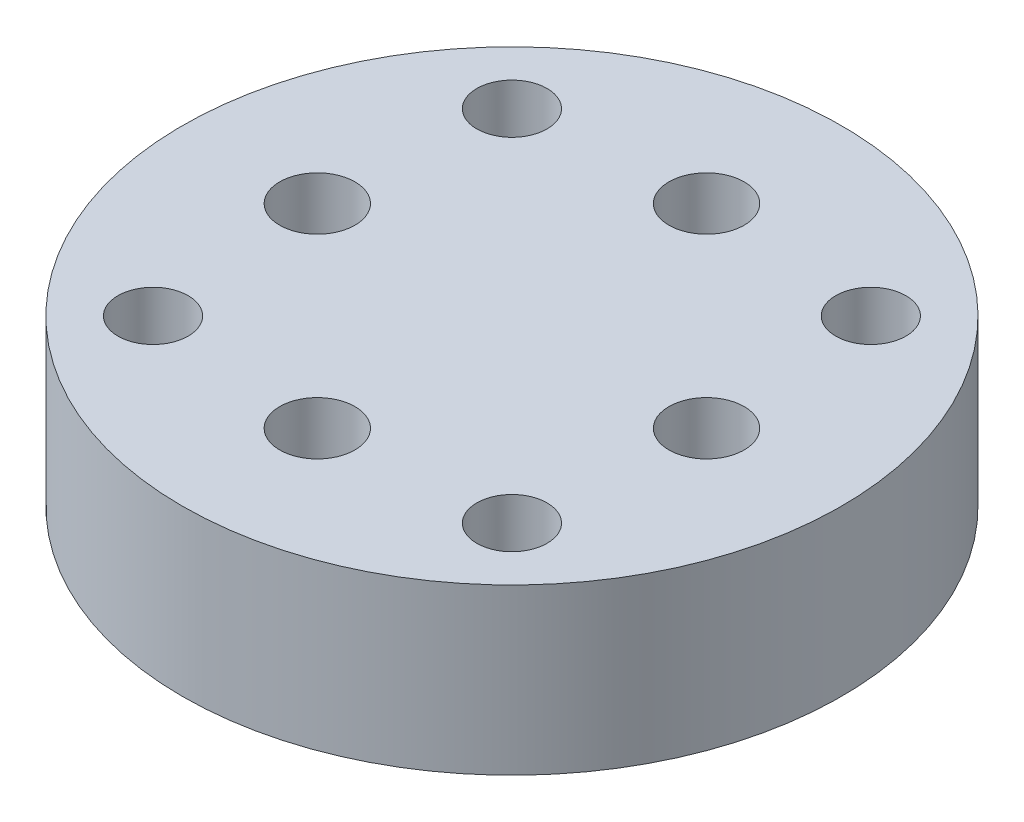
ISO-10303-21;
HEADER;
FILE_DESCRIPTION(('STEP AP214'),'2;1');
FILE_NAME('part.step','',(''),(''),'','','');
FILE_SCHEMA(('AUTOMOTIVE_DESIGN { 1 0 10303 214 1 1 1 1 }'));
ENDSEC;
DATA;
#1=APPLICATION_CONTEXT('core data for automotive mechanical design processes');
#2=APPLICATION_PROTOCOL_DEFINITION('international standard','automotive_design',2000,#1);
#3=PRODUCT_CONTEXT('',#1,'mechanical');
#4=PRODUCT('Part','Part','',(#3));
#5=PRODUCT_RELATED_PRODUCT_CATEGORY('part','',(#4));
#6=PRODUCT_DEFINITION_FORMATION('','',#4);
#7=PRODUCT_DEFINITION_CONTEXT('part definition',#1,'design');
#8=PRODUCT_DEFINITION('design','',#6,#7);
#9=PRODUCT_DEFINITION_SHAPE('','',#8);
#10=(LENGTH_UNIT() NAMED_UNIT(*) SI_UNIT(.MILLI.,.METRE.));
#11=(NAMED_UNIT(*) PLANE_ANGLE_UNIT() SI_UNIT($,.RADIAN.));
#12=(NAMED_UNIT(*) SI_UNIT($,.STERADIAN.) SOLID_ANGLE_UNIT());
#13=UNCERTAINTY_MEASURE_WITH_UNIT(LENGTH_MEASURE(1.E-05),#10,'distance_accuracy_value','');
#14=(GEOMETRIC_REPRESENTATION_CONTEXT(3) GLOBAL_UNCERTAINTY_ASSIGNED_CONTEXT((#13)) GLOBAL_UNIT_ASSIGNED_CONTEXT((#10,
#11,#12)) REPRESENTATION_CONTEXT('',''));
#15=CARTESIAN_POINT('',(0.,0.,0.));
#16=DIRECTION('',(0.,0.,1.));
#17=DIRECTION('',(1.,0.,0.));
#18=AXIS2_PLACEMENT_3D('',#15,#16,#17);
#19=CARTESIAN_POINT('',(0.,6.35,0.));
#20=DIRECTION('',(0.,-1.,0.));
#21=DIRECTION('',(0.,0.,-1.));
#22=AXIS2_PLACEMENT_3D('',#19,#20,#21);
#23=CYLINDRICAL_SURFACE('',#22,12.7);
#24=CARTESIAN_POINT('',(0.,6.35,0.));
#25=DIRECTION('',(0.,1.,0.));
#26=DIRECTION('',(0.,0.,1.));
#27=AXIS2_PLACEMENT_3D('',#24,#25,#26);
#28=CIRCLE('',#27,12.7);
#29=CARTESIAN_POINT('',(0.,6.35,12.7));
#30=VERTEX_POINT('',#29);
#31=EDGE_CURVE('E10',#30,#30,#28,.T.);
#32=ORIENTED_EDGE('',*,*,#31,.F.);
#33=EDGE_LOOP('',(#32));
#34=FACE_BOUND('',#33,.T.);
#35=CARTESIAN_POINT('',(0.,0.,0.));
#36=DIRECTION('',(0.,1.,0.));
#37=DIRECTION('',(0.,0.,1.));
#38=AXIS2_PLACEMENT_3D('',#35,#36,#37);
#39=CIRCLE('',#38,12.7);
#40=CARTESIAN_POINT('',(0.,0.,12.7));
#41=VERTEX_POINT('',#40);
#42=EDGE_CURVE('E34',#41,#41,#39,.T.);
#43=ORIENTED_EDGE('',*,*,#42,.T.);
#44=EDGE_LOOP('',(#43));
#45=FACE_BOUND('',#44,.T.);
#46=ADVANCED_FACE('F31',(#34,#45),#23,.T.);
#47=CARTESIAN_POINT('',(0.,6.35,0.));
#48=DIRECTION('',(0.,1.,0.));
#49=DIRECTION('',(0.,0.,1.));
#50=AXIS2_PLACEMENT_3D('',#47,#48,#49);
#51=PLANE('',#50);
#52=CARTESIAN_POINT('',(-6.91479721322325,6.35,6.91479721322325));
#53=DIRECTION('',(0.,1.,0.));
#54=DIRECTION('',(0.,0.,1.));
#55=AXIS2_PLACEMENT_3D('',#52,#53,#54);
#56=CIRCLE('',#55,1.35254999999999);
#57=CARTESIAN_POINT('',(-6.91479721322325,6.35,8.26734721322325));
#58=VERTEX_POINT('',#57);
#59=EDGE_CURVE('E96',#58,#58,#56,.T.);
#60=ORIENTED_EDGE('',*,*,#59,.F.);
#61=EDGE_LOOP('',(#60));
#62=FACE_BOUND('',#61,.T.);
#63=CARTESIAN_POINT('',(6.91479721322325,6.35,6.91479721322325));
#64=DIRECTION('',(0.,1.,0.));
#65=DIRECTION('',(0.,0.,1.));
#66=AXIS2_PLACEMENT_3D('',#63,#64,#65);
#67=CIRCLE('',#66,1.35254999999999);
#68=CARTESIAN_POINT('',(6.91479721322325,6.35,8.26734721322325));
#69=VERTEX_POINT('',#68);
#70=EDGE_CURVE('E90',#69,#69,#67,.T.);
#71=ORIENTED_EDGE('',*,*,#70,.F.);
#72=EDGE_LOOP('',(#71));
#73=FACE_BOUND('',#72,.T.);
#74=CARTESIAN_POINT('',(6.91479721322325,6.35,-6.91479721322325));
#75=DIRECTION('',(0.,1.,0.));
#76=DIRECTION('',(0.,0.,1.));
#77=AXIS2_PLACEMENT_3D('',#74,#75,#76);
#78=CIRCLE('',#77,1.35254999999999);
#79=CARTESIAN_POINT('',(6.91479721322325,6.35,-5.56224721322325));
#80=VERTEX_POINT('',#79);
#81=EDGE_CURVE('E84',#80,#80,#78,.T.);
#82=ORIENTED_EDGE('',*,*,#81,.F.);
#83=EDGE_LOOP('',(#82));
#84=FACE_BOUND('',#83,.T.);
#85=CARTESIAN_POINT('',(-6.91479721322325,6.35,-6.91479721322325));
#86=DIRECTION('',(0.,1.,0.));
#87=DIRECTION('',(0.,0.,1.));
#88=AXIS2_PLACEMENT_3D('',#85,#86,#87);
#89=CIRCLE('',#88,1.35254999999999);
#90=CARTESIAN_POINT('',(-6.91479721322325,6.35,-5.56224721322326));
#91=VERTEX_POINT('',#90);
#92=EDGE_CURVE('E78',#91,#91,#89,.T.);
#93=ORIENTED_EDGE('',*,*,#92,.F.);
#94=EDGE_LOOP('',(#93));
#95=FACE_BOUND('',#94,.T.);
#96=CARTESIAN_POINT('',(-7.5,6.35,0.));
#97=DIRECTION('',(0.,-1.,0.));
#98=DIRECTION('',(0.,0.,-1.));
#99=AXIS2_PLACEMENT_3D('',#96,#97,#98);
#100=CIRCLE('',#99,1.45);
#101=CARTESIAN_POINT('',(-7.5,6.35,-1.45));
#102=VERTEX_POINT('',#101);
#103=EDGE_CURVE('E69',#102,#102,#100,.T.);
#104=ORIENTED_EDGE('',*,*,#103,.T.);
#105=EDGE_LOOP('',(#104));
#106=FACE_BOUND('',#105,.T.);
#107=CARTESIAN_POINT('',(7.5,6.35,0.));
#108=DIRECTION('',(0.,-1.,0.));
#109=DIRECTION('',(0.,0.,-1.));
#110=AXIS2_PLACEMENT_3D('',#107,#108,#109);
#111=CIRCLE('',#110,1.45);
#112=CARTESIAN_POINT('',(7.5,6.35,-1.45));
#113=VERTEX_POINT('',#112);
#114=EDGE_CURVE('E60',#113,#113,#111,.T.);
#115=ORIENTED_EDGE('',*,*,#114,.T.);
#116=EDGE_LOOP('',(#115));
#117=FACE_BOUND('',#116,.T.);
#118=CARTESIAN_POINT('',(0.,6.35,7.5));
#119=DIRECTION('',(0.,-1.,0.));
#120=DIRECTION('',(0.,0.,-1.));
#121=AXIS2_PLACEMENT_3D('',#118,#119,#120);
#122=CIRCLE('',#121,1.45);
#123=CARTESIAN_POINT('',(0.,6.35,6.05));
#124=VERTEX_POINT('',#123);
#125=EDGE_CURVE('E51',#124,#124,#122,.T.);
#126=ORIENTED_EDGE('',*,*,#125,.T.);
#127=EDGE_LOOP('',(#126));
#128=FACE_BOUND('',#127,.T.);
#129=CARTESIAN_POINT('',(0.,6.35,-7.5));
#130=DIRECTION('',(0.,-1.,0.));
#131=DIRECTION('',(0.,0.,-1.));
#132=AXIS2_PLACEMENT_3D('',#129,#130,#131);
#133=CIRCLE('',#132,1.45);
#134=CARTESIAN_POINT('',(0.,6.35,-8.95));
#135=VERTEX_POINT('',#134);
#136=EDGE_CURVE('E41',#135,#135,#133,.T.);
#137=ORIENTED_EDGE('',*,*,#136,.T.);
#138=EDGE_LOOP('',(#137));
#139=FACE_BOUND('',#138,.T.);
#140=ORIENTED_EDGE('',*,*,#31,.T.);
#141=EDGE_LOOP('',(#140));
#142=FACE_BOUND('',#141,.T.);
#143=ADVANCED_FACE('F109',(#62,#73,#84,#95,#106,#117,#128,#139,#142),#51,.T.);
#144=CARTESIAN_POINT('',(0.,0.,0.));
#145=DIRECTION('',(0.,1.,0.));
#146=DIRECTION('',(0.,0.,1.));
#147=AXIS2_PLACEMENT_3D('',#144,#145,#146);
#148=PLANE('',#147);
#149=CARTESIAN_POINT('',(-6.91479721322325,0.,6.91479721322325));
#150=DIRECTION('',(0.,-1.,0.));
#151=DIRECTION('',(0.,0.,-1.));
#152=AXIS2_PLACEMENT_3D('',#149,#150,#151);
#153=CIRCLE('',#152,1.35254999999999);
#154=CARTESIAN_POINT('',(-6.91479721322325,0.,5.56224721322326));
#155=VERTEX_POINT('',#154);
#156=EDGE_CURVE('E99',#155,#155,#153,.T.);
#157=ORIENTED_EDGE('',*,*,#156,.F.);
#158=EDGE_LOOP('',(#157));
#159=FACE_BOUND('',#158,.T.);
#160=CARTESIAN_POINT('',(6.91479721322325,0.,6.91479721322325));
#161=DIRECTION('',(0.,-1.,0.));
#162=DIRECTION('',(0.,0.,-1.));
#163=AXIS2_PLACEMENT_3D('',#160,#161,#162);
#164=CIRCLE('',#163,1.35254999999999);
#165=CARTESIAN_POINT('',(6.91479721322325,0.,5.56224721322326));
#166=VERTEX_POINT('',#165);
#167=EDGE_CURVE('E93',#166,#166,#164,.T.);
#168=ORIENTED_EDGE('',*,*,#167,.F.);
#169=EDGE_LOOP('',(#168));
#170=FACE_BOUND('',#169,.T.);
#171=CARTESIAN_POINT('',(6.91479721322325,0.,-6.91479721322325));
#172=DIRECTION('',(0.,-1.,0.));
#173=DIRECTION('',(0.,0.,-1.));
#174=AXIS2_PLACEMENT_3D('',#171,#172,#173);
#175=CIRCLE('',#174,1.35254999999999);
#176=CARTESIAN_POINT('',(6.91479721322325,0.,-8.26734721322324));
#177=VERTEX_POINT('',#176);
#178=EDGE_CURVE('E87',#177,#177,#175,.T.);
#179=ORIENTED_EDGE('',*,*,#178,.F.);
#180=EDGE_LOOP('',(#179));
#181=FACE_BOUND('',#180,.T.);
#182=CARTESIAN_POINT('',(-6.91479721322325,0.,-6.91479721322325));
#183=DIRECTION('',(0.,-1.,0.));
#184=DIRECTION('',(0.,0.,-1.));
#185=AXIS2_PLACEMENT_3D('',#182,#183,#184);
#186=CIRCLE('',#185,1.35254999999999);
#187=CARTESIAN_POINT('',(-6.91479721322325,0.,-8.26734721322324));
#188=VERTEX_POINT('',#187);
#189=EDGE_CURVE('E81',#188,#188,#186,.T.);
#190=ORIENTED_EDGE('',*,*,#189,.F.);
#191=EDGE_LOOP('',(#190));
#192=FACE_BOUND('',#191,.T.);
#193=CARTESIAN_POINT('',(-7.5,0.,0.));
#194=DIRECTION('',(0.,-1.,0.));
#195=DIRECTION('',(0.,0.,-1.));
#196=AXIS2_PLACEMENT_3D('',#193,#194,#195);
#197=CIRCLE('',#196,2.75);
#198=CARTESIAN_POINT('',(-7.5,0.,-2.75));
#199=VERTEX_POINT('',#198);
#200=EDGE_CURVE('E75',#199,#199,#197,.T.);
#201=ORIENTED_EDGE('',*,*,#200,.F.);
#202=EDGE_LOOP('',(#201));
#203=FACE_BOUND('',#202,.T.);
#204=CARTESIAN_POINT('',(7.5,0.,0.));
#205=DIRECTION('',(0.,-1.,0.));
#206=DIRECTION('',(0.,0.,-1.));
#207=AXIS2_PLACEMENT_3D('',#204,#205,#206);
#208=CIRCLE('',#207,2.75);
#209=CARTESIAN_POINT('',(7.5,0.,-2.75));
#210=VERTEX_POINT('',#209);
#211=EDGE_CURVE('E66',#210,#210,#208,.T.);
#212=ORIENTED_EDGE('',*,*,#211,.F.);
#213=EDGE_LOOP('',(#212));
#214=FACE_BOUND('',#213,.T.);
#215=CARTESIAN_POINT('',(0.,0.,7.5));
#216=DIRECTION('',(0.,-1.,0.));
#217=DIRECTION('',(0.,0.,-1.));
#218=AXIS2_PLACEMENT_3D('',#215,#216,#217);
#219=CIRCLE('',#218,2.75);
#220=CARTESIAN_POINT('',(0.,0.,4.75));
#221=VERTEX_POINT('',#220);
#222=EDGE_CURVE('E57',#221,#221,#219,.T.);
#223=ORIENTED_EDGE('',*,*,#222,.F.);
#224=EDGE_LOOP('',(#223));
#225=FACE_BOUND('',#224,.T.);
#226=CARTESIAN_POINT('',(0.,0.,-7.5));
#227=DIRECTION('',(0.,-1.,0.));
#228=DIRECTION('',(0.,0.,-1.));
#229=AXIS2_PLACEMENT_3D('',#226,#227,#228);
#230=CIRCLE('',#229,2.75);
#231=CARTESIAN_POINT('',(0.,0.,-10.25));
#232=VERTEX_POINT('',#231);
#233=EDGE_CURVE('E48',#232,#232,#230,.T.);
#234=ORIENTED_EDGE('',*,*,#233,.F.);
#235=EDGE_LOOP('',(#234));
#236=FACE_BOUND('',#235,.T.);
#237=ORIENTED_EDGE('',*,*,#42,.F.);
#238=EDGE_LOOP('',(#237));
#239=FACE_BOUND('',#238,.T.);
#240=ADVANCED_FACE('F105',(#159,#170,#181,#192,#203,#214,#225,#236,#239),#148,.F.);
#241=CARTESIAN_POINT('',(0.,0.,-7.5));
#242=DIRECTION('',(0.,-1.,0.));
#243=DIRECTION('',(0.,0.,-1.));
#244=AXIS2_PLACEMENT_3D('',#241,#242,#243);
#245=CYLINDRICAL_SURFACE('',#244,1.45);
#246=ORIENTED_EDGE('',*,*,#136,.F.);
#247=EDGE_LOOP('',(#246));
#248=FACE_BOUND('',#247,.T.);
#249=CARTESIAN_POINT('',(0.,1.3,-7.5));
#250=DIRECTION('',(0.,-1.,0.));
#251=DIRECTION('',(0.,0.,-1.));
#252=AXIS2_PLACEMENT_3D('',#249,#250,#251);
#253=CIRCLE('',#252,1.45);
#254=CARTESIAN_POINT('',(0.,1.3,-8.95));
#255=VERTEX_POINT('',#254);
#256=EDGE_CURVE('E45',#255,#255,#253,.T.);
#257=ORIENTED_EDGE('',*,*,#256,.T.);
#258=EDGE_LOOP('',(#257));
#259=FACE_BOUND('',#258,.T.);
#260=ADVANCED_FACE('F108',(#248,#259),#245,.F.);
#261=CARTESIAN_POINT('',(0.,0.,-7.5));
#262=DIRECTION('',(0.,-1.,0.));
#263=DIRECTION('',(0.,0.,-1.));
#264=AXIS2_PLACEMENT_3D('',#261,#262,#263);
#265=CONICAL_SURFACE('',#264,2.75,0.785398163397449);
#266=ORIENTED_EDGE('',*,*,#256,.F.);
#267=EDGE_LOOP('',(#266));
#268=FACE_BOUND('',#267,.T.);
#269=ORIENTED_EDGE('',*,*,#233,.T.);
#270=EDGE_LOOP('',(#269));
#271=FACE_BOUND('',#270,.T.);
#272=ADVANCED_FACE('F140',(#268,#271),#265,.F.);
#273=CARTESIAN_POINT('',(0.,0.,7.5));
#274=DIRECTION('',(0.,-1.,0.));
#275=DIRECTION('',(0.,0.,-1.));
#276=AXIS2_PLACEMENT_3D('',#273,#274,#275);
#277=CYLINDRICAL_SURFACE('',#276,1.45);
#278=ORIENTED_EDGE('',*,*,#125,.F.);
#279=EDGE_LOOP('',(#278));
#280=FACE_BOUND('',#279,.T.);
#281=CARTESIAN_POINT('',(0.,1.3,7.5));
#282=DIRECTION('',(0.,-1.,0.));
#283=DIRECTION('',(0.,0.,-1.));
#284=AXIS2_PLACEMENT_3D('',#281,#282,#283);
#285=CIRCLE('',#284,1.45);
#286=CARTESIAN_POINT('',(0.,1.3,6.05));
#287=VERTEX_POINT('',#286);
#288=EDGE_CURVE('E54',#287,#287,#285,.T.);
#289=ORIENTED_EDGE('',*,*,#288,.T.);
#290=EDGE_LOOP('',(#289));
#291=FACE_BOUND('',#290,.T.);
#292=ADVANCED_FACE('F144',(#280,#291),#277,.F.);
#293=CARTESIAN_POINT('',(0.,0.,7.5));
#294=DIRECTION('',(0.,-1.,0.));
#295=DIRECTION('',(0.,0.,-1.));
#296=AXIS2_PLACEMENT_3D('',#293,#294,#295);
#297=CONICAL_SURFACE('',#296,2.75,0.785398163397449);
#298=ORIENTED_EDGE('',*,*,#288,.F.);
#299=EDGE_LOOP('',(#298));
#300=FACE_BOUND('',#299,.T.);
#301=ORIENTED_EDGE('',*,*,#222,.T.);
#302=EDGE_LOOP('',(#301));
#303=FACE_BOUND('',#302,.T.);
#304=ADVANCED_FACE('F148',(#300,#303),#297,.F.);
#305=CARTESIAN_POINT('',(7.5,0.,0.));
#306=DIRECTION('',(0.,-1.,0.));
#307=DIRECTION('',(0.,0.,-1.));
#308=AXIS2_PLACEMENT_3D('',#305,#306,#307);
#309=CYLINDRICAL_SURFACE('',#308,1.45);
#310=ORIENTED_EDGE('',*,*,#114,.F.);
#311=EDGE_LOOP('',(#310));
#312=FACE_BOUND('',#311,.T.);
#313=CARTESIAN_POINT('',(7.5,1.3,0.));
#314=DIRECTION('',(0.,-1.,0.));
#315=DIRECTION('',(0.,0.,-1.));
#316=AXIS2_PLACEMENT_3D('',#313,#314,#315);
#317=CIRCLE('',#316,1.45);
#318=CARTESIAN_POINT('',(7.5,1.3,-1.45));
#319=VERTEX_POINT('',#318);
#320=EDGE_CURVE('E63',#319,#319,#317,.T.);
#321=ORIENTED_EDGE('',*,*,#320,.T.);
#322=EDGE_LOOP('',(#321));
#323=FACE_BOUND('',#322,.T.);
#324=ADVANCED_FACE('F152',(#312,#323),#309,.F.);
#325=CARTESIAN_POINT('',(7.5,0.,0.));
#326=DIRECTION('',(0.,-1.,0.));
#327=DIRECTION('',(0.,0.,-1.));
#328=AXIS2_PLACEMENT_3D('',#325,#326,#327);
#329=CONICAL_SURFACE('',#328,2.75,0.785398163397448);
#330=ORIENTED_EDGE('',*,*,#320,.F.);
#331=EDGE_LOOP('',(#330));
#332=FACE_BOUND('',#331,.T.);
#333=ORIENTED_EDGE('',*,*,#211,.T.);
#334=EDGE_LOOP('',(#333));
#335=FACE_BOUND('',#334,.T.);
#336=ADVANCED_FACE('F156',(#332,#335),#329,.F.);
#337=CARTESIAN_POINT('',(-7.5,0.,0.));
#338=DIRECTION('',(0.,-1.,0.));
#339=DIRECTION('',(0.,0.,-1.));
#340=AXIS2_PLACEMENT_3D('',#337,#338,#339);
#341=CYLINDRICAL_SURFACE('',#340,1.45);
#342=ORIENTED_EDGE('',*,*,#103,.F.);
#343=EDGE_LOOP('',(#342));
#344=FACE_BOUND('',#343,.T.);
#345=CARTESIAN_POINT('',(-7.5,1.3,0.));
#346=DIRECTION('',(0.,-1.,0.));
#347=DIRECTION('',(0.,0.,-1.));
#348=AXIS2_PLACEMENT_3D('',#345,#346,#347);
#349=CIRCLE('',#348,1.45);
#350=CARTESIAN_POINT('',(-7.5,1.3,-1.45));
#351=VERTEX_POINT('',#350);
#352=EDGE_CURVE('E72',#351,#351,#349,.T.);
#353=ORIENTED_EDGE('',*,*,#352,.T.);
#354=EDGE_LOOP('',(#353));
#355=FACE_BOUND('',#354,.T.);
#356=ADVANCED_FACE('F160',(#344,#355),#341,.F.);
#357=CARTESIAN_POINT('',(-7.5,0.,0.));
#358=DIRECTION('',(0.,-1.,0.));
#359=DIRECTION('',(0.,0.,-1.));
#360=AXIS2_PLACEMENT_3D('',#357,#358,#359);
#361=CONICAL_SURFACE('',#360,2.75,0.785398163397449);
#362=ORIENTED_EDGE('',*,*,#352,.F.);
#363=EDGE_LOOP('',(#362));
#364=FACE_BOUND('',#363,.T.);
#365=ORIENTED_EDGE('',*,*,#200,.T.);
#366=EDGE_LOOP('',(#365));
#367=FACE_BOUND('',#366,.T.);
#368=ADVANCED_FACE('F164',(#364,#367),#361,.F.);
#369=CARTESIAN_POINT('',(-6.91479721322325,0.,-6.91479721322325));
#370=DIRECTION('',(0.,-1.,0.));
#371=DIRECTION('',(0.,0.,-1.));
#372=AXIS2_PLACEMENT_3D('',#369,#370,#371);
#373=CYLINDRICAL_SURFACE('',#372,1.35254999999999);
#374=ORIENTED_EDGE('',*,*,#92,.T.);
#375=EDGE_LOOP('',(#374));
#376=FACE_BOUND('',#375,.T.);
#377=ORIENTED_EDGE('',*,*,#189,.T.);
#378=EDGE_LOOP('',(#377));
#379=FACE_BOUND('',#378,.T.);
#380=ADVANCED_FACE('F168',(#376,#379),#373,.F.);
#381=CARTESIAN_POINT('',(6.91479721322325,0.,-6.91479721322325));
#382=DIRECTION('',(0.,-1.,0.));
#383=DIRECTION('',(0.,0.,-1.));
#384=AXIS2_PLACEMENT_3D('',#381,#382,#383);
#385=CYLINDRICAL_SURFACE('',#384,1.35254999999999);
#386=ORIENTED_EDGE('',*,*,#81,.T.);
#387=EDGE_LOOP('',(#386));
#388=FACE_BOUND('',#387,.T.);
#389=ORIENTED_EDGE('',*,*,#178,.T.);
#390=EDGE_LOOP('',(#389));
#391=FACE_BOUND('',#390,.T.);
#392=ADVANCED_FACE('F172',(#388,#391),#385,.F.);
#393=CARTESIAN_POINT('',(6.91479721322325,0.,6.91479721322325));
#394=DIRECTION('',(0.,-1.,0.));
#395=DIRECTION('',(0.,0.,-1.));
#396=AXIS2_PLACEMENT_3D('',#393,#394,#395);
#397=CYLINDRICAL_SURFACE('',#396,1.35254999999999);
#398=ORIENTED_EDGE('',*,*,#70,.T.);
#399=EDGE_LOOP('',(#398));
#400=FACE_BOUND('',#399,.T.);
#401=ORIENTED_EDGE('',*,*,#167,.T.);
#402=EDGE_LOOP('',(#401));
#403=FACE_BOUND('',#402,.T.);
#404=ADVANCED_FACE('F176',(#400,#403),#397,.F.);
#405=CARTESIAN_POINT('',(-6.91479721322325,0.,6.91479721322325));
#406=DIRECTION('',(0.,-1.,0.));
#407=DIRECTION('',(0.,0.,-1.));
#408=AXIS2_PLACEMENT_3D('',#405,#406,#407);
#409=CYLINDRICAL_SURFACE('',#408,1.35254999999999);
#410=ORIENTED_EDGE('',*,*,#59,.T.);
#411=EDGE_LOOP('',(#410));
#412=FACE_BOUND('',#411,.T.);
#413=ORIENTED_EDGE('',*,*,#156,.T.);
#414=EDGE_LOOP('',(#413));
#415=FACE_BOUND('',#414,.T.);
#416=ADVANCED_FACE('F103',(#412,#415),#409,.F.);
#417=CLOSED_SHELL('',(#46,#143,#240,#260,#272,#292,#304,#324,#336,#356,#368,#380,#392,#404,#416));
#418=MANIFOLD_SOLID_BREP('B2',#417);
#419=ADVANCED_BREP_SHAPE_REPRESENTATION('',(#18,#418),#14);
#420=SHAPE_DEFINITION_REPRESENTATION(#9,#419);
ENDSEC;
END-ISO-10303-21;
